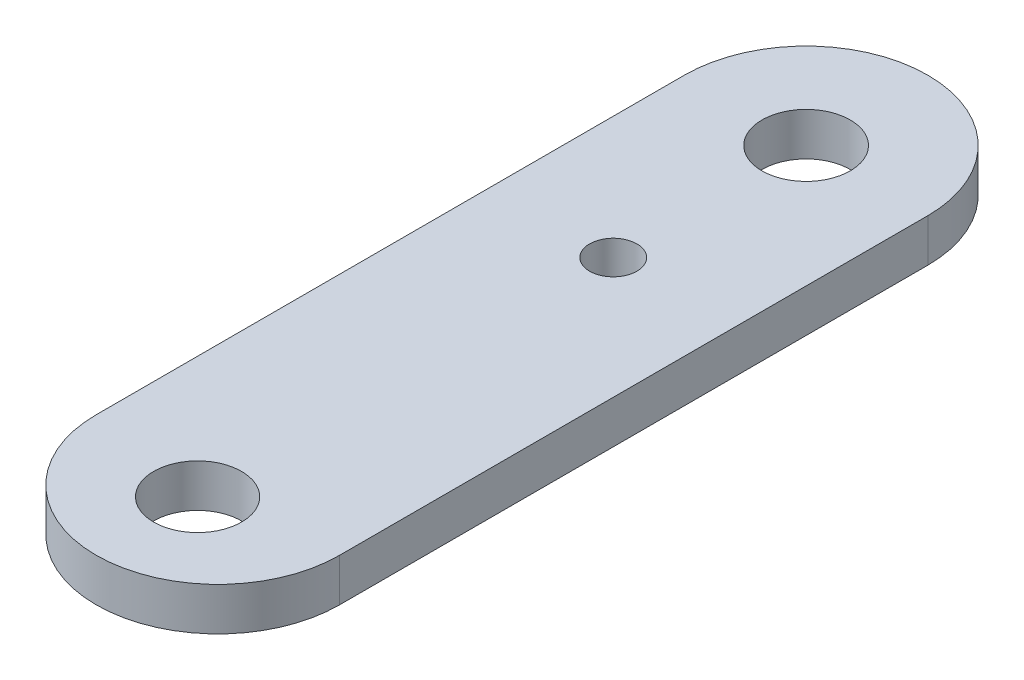
ISO-10303-21;
HEADER;
FILE_DESCRIPTION(('STEP AP214'),'2;1');
FILE_NAME('part.step','',(''),(''),'','','');
FILE_SCHEMA(('AUTOMOTIVE_DESIGN { 1 0 10303 214 1 1 1 1 }'));
ENDSEC;
DATA;
#1=APPLICATION_CONTEXT('core data for automotive mechanical design processes');
#2=APPLICATION_PROTOCOL_DEFINITION('international standard','automotive_design',2000,#1);
#3=PRODUCT_CONTEXT('',#1,'mechanical');
#4=PRODUCT('Part','Part','',(#3));
#5=PRODUCT_RELATED_PRODUCT_CATEGORY('part','',(#4));
#6=PRODUCT_DEFINITION_FORMATION('','',#4);
#7=PRODUCT_DEFINITION_CONTEXT('part definition',#1,'design');
#8=PRODUCT_DEFINITION('design','',#6,#7);
#9=PRODUCT_DEFINITION_SHAPE('','',#8);
#10=(LENGTH_UNIT() NAMED_UNIT(*) SI_UNIT(.MILLI.,.METRE.));
#11=(NAMED_UNIT(*) PLANE_ANGLE_UNIT() SI_UNIT($,.RADIAN.));
#12=(NAMED_UNIT(*) SI_UNIT($,.STERADIAN.) SOLID_ANGLE_UNIT());
#13=UNCERTAINTY_MEASURE_WITH_UNIT(LENGTH_MEASURE(1.E-05),#10,'distance_accuracy_value','');
#14=(GEOMETRIC_REPRESENTATION_CONTEXT(3) GLOBAL_UNCERTAINTY_ASSIGNED_CONTEXT((#13)) GLOBAL_UNIT_ASSIGNED_CONTEXT((#10,
#11,#12)) REPRESENTATION_CONTEXT('',''));
#15=CARTESIAN_POINT('',(0.,0.,0.));
#16=DIRECTION('',(0.,0.,1.));
#17=DIRECTION('',(1.,0.,0.));
#18=AXIS2_PLACEMENT_3D('',#15,#16,#17);
#19=CARTESIAN_POINT('',(0.,-3.175,-1.5));
#20=DIRECTION('',(0.,1.,0.));
#21=DIRECTION('',(0.,0.,1.));
#22=AXIS2_PLACEMENT_3D('',#19,#20,#21);
#23=CYLINDRICAL_SURFACE('',#22,9.);
#24=CARTESIAN_POINT('',(0.,0.,-1.5));
#25=DIRECTION('',(0.,1.,0.));
#26=DIRECTION('',(0.,0.,1.));
#27=AXIS2_PLACEMENT_3D('',#24,#25,#26);
#28=CIRCLE('',#27,9.);
#29=CARTESIAN_POINT('',(-9.,0.,-1.5));
#30=VERTEX_POINT('',#29);
#31=CARTESIAN_POINT('',(9.,0.,-1.5));
#32=VERTEX_POINT('',#31);
#33=EDGE_CURVE('E107',#30,#32,#28,.T.);
#34=ORIENTED_EDGE('',*,*,#33,.F.);
#35=DIRECTION('',(0.,1.,0.));
#36=VECTOR('',#35,1.);
#37=CARTESIAN_POINT('',(-9.,-3.175,-1.5));
#38=LINE('',#37,#36);
#39=CARTESIAN_POINT('',(-9.,-3.175,-1.5));
#40=VERTEX_POINT('',#39);
#41=EDGE_CURVE('E11',#40,#30,#38,.T.);
#42=ORIENTED_EDGE('',*,*,#41,.F.);
#43=CARTESIAN_POINT('',(0.,-3.175,-1.5));
#44=DIRECTION('',(0.,1.,0.));
#45=DIRECTION('',(0.,0.,1.));
#46=AXIS2_PLACEMENT_3D('',#43,#44,#45);
#47=CIRCLE('',#46,9.);
#48=CARTESIAN_POINT('',(9.,-3.175,-1.5));
#49=VERTEX_POINT('',#48);
#50=EDGE_CURVE('E100',#40,#49,#47,.T.);
#51=ORIENTED_EDGE('',*,*,#50,.T.);
#52=DIRECTION('',(0.,1.,0.));
#53=VECTOR('',#52,1.);
#54=CARTESIAN_POINT('',(9.,-3.175,-1.5));
#55=LINE('',#54,#53);
#56=EDGE_CURVE('E45',#49,#32,#55,.T.);
#57=ORIENTED_EDGE('',*,*,#56,.T.);
#58=EDGE_LOOP('',(#34,#42,#51,#57));
#59=FACE_BOUND('',#58,.T.);
#60=ADVANCED_FACE('F42',(#59),#23,.T.);
#61=CARTESIAN_POINT('',(-9.,-3.175,-1.5));
#62=DIRECTION('',(-1.,0.,0.));
#63=DIRECTION('',(0.,0.,1.));
#64=AXIS2_PLACEMENT_3D('',#61,#62,#63);
#65=PLANE('',#64);
#66=DIRECTION('',(0.,0.,1.));
#67=VECTOR('',#66,1.);
#68=CARTESIAN_POINT('',(-9.,0.,-1.5));
#69=LINE('',#68,#67);
#70=CARTESIAN_POINT('',(-9.,0.,-45.));
#71=VERTEX_POINT('',#70);
#72=EDGE_CURVE('E102',#71,#30,#69,.T.);
#73=ORIENTED_EDGE('',*,*,#72,.F.);
#74=DIRECTION('',(0.,1.,0.));
#75=VECTOR('',#74,1.);
#76=CARTESIAN_POINT('',(-9.,-3.175,-45.));
#77=LINE('',#76,#75);
#78=CARTESIAN_POINT('',(-9.,-3.175,-45.));
#79=VERTEX_POINT('',#78);
#80=EDGE_CURVE('E51',#79,#71,#77,.T.);
#81=ORIENTED_EDGE('',*,*,#80,.F.);
#82=DIRECTION('',(0.,0.,1.));
#83=VECTOR('',#82,1.);
#84=CARTESIAN_POINT('',(-9.,-3.175,-1.5));
#85=LINE('',#84,#83);
#86=EDGE_CURVE('E97',#79,#40,#85,.T.);
#87=ORIENTED_EDGE('',*,*,#86,.T.);
#88=ORIENTED_EDGE('',*,*,#41,.T.);
#89=EDGE_LOOP('',(#73,#81,#87,#88));
#90=FACE_BOUND('',#89,.T.);
#91=ADVANCED_FACE('F118',(#90),#65,.T.);
#92=CARTESIAN_POINT('',(0.,-3.175,-45.));
#93=DIRECTION('',(0.,1.,0.));
#94=DIRECTION('',(0.,0.,1.));
#95=AXIS2_PLACEMENT_3D('',#92,#93,#94);
#96=CYLINDRICAL_SURFACE('',#95,9.);
#97=CARTESIAN_POINT('',(0.,0.,-45.));
#98=DIRECTION('',(0.,1.,0.));
#99=DIRECTION('',(0.,0.,-1.));
#100=AXIS2_PLACEMENT_3D('',#97,#98,#99);
#101=CIRCLE('',#100,9.);
#102=CARTESIAN_POINT('',(9.,0.,-45.));
#103=VERTEX_POINT('',#102);
#104=EDGE_CURVE('E92',#103,#71,#101,.T.);
#105=ORIENTED_EDGE('',*,*,#104,.F.);
#106=DIRECTION('',(0.,1.,0.));
#107=VECTOR('',#106,1.);
#108=CARTESIAN_POINT('',(9.,-3.175,-45.));
#109=LINE('',#108,#107);
#110=CARTESIAN_POINT('',(9.,-3.175,-45.));
#111=VERTEX_POINT('',#110);
#112=EDGE_CURVE('E87',#111,#103,#109,.T.);
#113=ORIENTED_EDGE('',*,*,#112,.F.);
#114=CARTESIAN_POINT('',(0.,-3.175,-45.));
#115=DIRECTION('',(0.,1.,0.));
#116=DIRECTION('',(0.,0.,-1.));
#117=AXIS2_PLACEMENT_3D('',#114,#115,#116);
#118=CIRCLE('',#117,9.);
#119=EDGE_CURVE('E90',#111,#79,#118,.T.);
#120=ORIENTED_EDGE('',*,*,#119,.T.);
#121=ORIENTED_EDGE('',*,*,#80,.T.);
#122=EDGE_LOOP('',(#105,#113,#120,#121));
#123=FACE_BOUND('',#122,.T.);
#124=ADVANCED_FACE('F89',(#123),#96,.T.);
#125=CARTESIAN_POINT('',(9.,-3.175,-1.5));
#126=DIRECTION('',(1.,0.,0.));
#127=DIRECTION('',(0.,0.,-1.));
#128=AXIS2_PLACEMENT_3D('',#125,#126,#127);
#129=PLANE('',#128);
#130=DIRECTION('',(0.,0.,-1.));
#131=VECTOR('',#130,1.);
#132=CARTESIAN_POINT('',(9.,0.,-1.5));
#133=LINE('',#132,#131);
#134=EDGE_CURVE('E110',#32,#103,#133,.T.);
#135=ORIENTED_EDGE('',*,*,#134,.F.);
#136=ORIENTED_EDGE('',*,*,#56,.F.);
#137=DIRECTION('',(0.,0.,-1.));
#138=VECTOR('',#137,1.);
#139=CARTESIAN_POINT('',(9.,-3.175,-1.5));
#140=LINE('',#139,#138);
#141=EDGE_CURVE('E96',#49,#111,#140,.T.);
#142=ORIENTED_EDGE('',*,*,#141,.T.);
#143=ORIENTED_EDGE('',*,*,#112,.T.);
#144=EDGE_LOOP('',(#135,#136,#142,#143));
#145=FACE_BOUND('',#144,.T.);
#146=ADVANCED_FACE('F99',(#145),#129,.T.);
#147=CARTESIAN_POINT('',(0.,-3.175,-1.5));
#148=DIRECTION('',(0.,1.,0.));
#149=DIRECTION('',(0.,0.,1.));
#150=AXIS2_PLACEMENT_3D('',#147,#148,#149);
#151=PLANE('',#150);
#152=CARTESIAN_POINT('',(0.0499999999996999,-3.175,-30.6875039859444));
#153=DIRECTION('',(0.,-1.,0.));
#154=DIRECTION('',(0.,0.,-1.));
#155=AXIS2_PLACEMENT_3D('',#152,#153,#154);
#156=CIRCLE('',#155,1.75);
#157=CARTESIAN_POINT('',(0.0499999999996999,-3.175,-32.4375039859444));
#158=VERTEX_POINT('',#157);
#159=EDGE_CURVE('E158',#158,#158,#156,.T.);
#160=ORIENTED_EDGE('',*,*,#159,.F.);
#161=EDGE_LOOP('',(#160));
#162=FACE_BOUND('',#161,.T.);
#163=CARTESIAN_POINT('',(0.,-3.175,-45.));
#164=DIRECTION('',(0.,1.,0.));
#165=DIRECTION('',(0.,0.,1.));
#166=AXIS2_PLACEMENT_3D('',#163,#164,#165);
#167=CIRCLE('',#166,3.26390000000001);
#168=CARTESIAN_POINT('',(0.,-3.175,-41.7361));
#169=VERTEX_POINT('',#168);
#170=EDGE_CURVE('E162',#169,#169,#167,.T.);
#171=ORIENTED_EDGE('',*,*,#170,.T.);
#172=EDGE_LOOP('',(#171));
#173=FACE_BOUND('',#172,.T.);
#174=CARTESIAN_POINT('',(0.,-3.175,0.));
#175=DIRECTION('',(0.,1.,0.));
#176=DIRECTION('',(0.,0.,1.));
#177=AXIS2_PLACEMENT_3D('',#174,#175,#176);
#178=CIRCLE('',#177,3.25);
#179=CARTESIAN_POINT('',(0.,-3.175,3.25));
#180=VERTEX_POINT('',#179);
#181=EDGE_CURVE('E111',#180,#180,#178,.T.);
#182=ORIENTED_EDGE('',*,*,#181,.T.);
#183=EDGE_LOOP('',(#182));
#184=FACE_BOUND('',#183,.T.);
#185=ORIENTED_EDGE('',*,*,#50,.F.);
#186=ORIENTED_EDGE('',*,*,#86,.F.);
#187=ORIENTED_EDGE('',*,*,#119,.F.);
#188=ORIENTED_EDGE('',*,*,#141,.F.);
#189=EDGE_LOOP('',(#185,#186,#187,#188));
#190=FACE_BOUND('',#189,.T.);
#191=ADVANCED_FACE('F95',(#162,#173,#184,#190),#151,.F.);
#192=CARTESIAN_POINT('',(0.,0.,-1.5));
#193=DIRECTION('',(0.,1.,0.));
#194=DIRECTION('',(0.,0.,1.));
#195=AXIS2_PLACEMENT_3D('',#192,#193,#194);
#196=PLANE('',#195);
#197=CARTESIAN_POINT('',(0.0499999999996999,0.,-30.6875039859444));
#198=DIRECTION('',(0.,1.,0.));
#199=DIRECTION('',(0.,0.,1.));
#200=AXIS2_PLACEMENT_3D('',#197,#198,#199);
#201=CIRCLE('',#200,1.75);
#202=CARTESIAN_POINT('',(0.0499999999996999,0.,-28.9375039859444));
#203=VERTEX_POINT('',#202);
#204=EDGE_CURVE('E156',#203,#203,#201,.F.);
#205=ORIENTED_EDGE('',*,*,#204,.T.);
#206=EDGE_LOOP('',(#205));
#207=FACE_BOUND('',#206,.T.);
#208=CARTESIAN_POINT('',(0.,0.,-45.));
#209=DIRECTION('',(0.,1.,0.));
#210=DIRECTION('',(0.,0.,1.));
#211=AXIS2_PLACEMENT_3D('',#208,#209,#210);
#212=CIRCLE('',#211,3.26390000000001);
#213=CARTESIAN_POINT('',(0.,0.,-41.7361));
#214=VERTEX_POINT('',#213);
#215=EDGE_CURVE('E159',#214,#214,#212,.T.);
#216=ORIENTED_EDGE('',*,*,#215,.F.);
#217=EDGE_LOOP('',(#216));
#218=FACE_BOUND('',#217,.T.);
#219=CARTESIAN_POINT('',(0.,0.,0.));
#220=DIRECTION('',(0.,1.,0.));
#221=DIRECTION('',(0.,0.,1.));
#222=AXIS2_PLACEMENT_3D('',#219,#220,#221);
#223=CIRCLE('',#222,3.25);
#224=CARTESIAN_POINT('',(0.,0.,3.25));
#225=VERTEX_POINT('',#224);
#226=EDGE_CURVE('E167',#225,#225,#223,.T.);
#227=ORIENTED_EDGE('',*,*,#226,.F.);
#228=EDGE_LOOP('',(#227));
#229=FACE_BOUND('',#228,.T.);
#230=ORIENTED_EDGE('',*,*,#33,.T.);
#231=ORIENTED_EDGE('',*,*,#134,.T.);
#232=ORIENTED_EDGE('',*,*,#104,.T.);
#233=ORIENTED_EDGE('',*,*,#72,.T.);
#234=EDGE_LOOP('',(#230,#231,#232,#233));
#235=FACE_BOUND('',#234,.T.);
#236=ADVANCED_FACE('F117',(#207,#218,#229,#235),#196,.T.);
#237=CARTESIAN_POINT('',(0.,-3.175,0.));
#238=DIRECTION('',(0.,1.,0.));
#239=DIRECTION('',(0.,0.,1.));
#240=AXIS2_PLACEMENT_3D('',#237,#238,#239);
#241=CYLINDRICAL_SURFACE('',#240,3.25);
#242=ORIENTED_EDGE('',*,*,#181,.F.);
#243=EDGE_LOOP('',(#242));
#244=FACE_BOUND('',#243,.T.);
#245=ORIENTED_EDGE('',*,*,#226,.T.);
#246=EDGE_LOOP('',(#245));
#247=FACE_BOUND('',#246,.T.);
#248=ADVANCED_FACE('F138',(#244,#247),#241,.F.);
#249=CARTESIAN_POINT('',(0.,-3.175,-45.));
#250=DIRECTION('',(0.,1.,0.));
#251=DIRECTION('',(0.,0.,1.));
#252=AXIS2_PLACEMENT_3D('',#249,#250,#251);
#253=CYLINDRICAL_SURFACE('',#252,3.26390000000001);
#254=ORIENTED_EDGE('',*,*,#170,.F.);
#255=EDGE_LOOP('',(#254));
#256=FACE_BOUND('',#255,.T.);
#257=ORIENTED_EDGE('',*,*,#215,.T.);
#258=EDGE_LOOP('',(#257));
#259=FACE_BOUND('',#258,.T.);
#260=ADVANCED_FACE('F144',(#256,#259),#253,.F.);
#261=CARTESIAN_POINT('',(0.0499999999996999,0.00100000000000013,-30.6875039859444));
#262=DIRECTION('',(0.,-1.,0.));
#263=DIRECTION('',(0.,0.,-1.));
#264=AXIS2_PLACEMENT_3D('',#261,#262,#263);
#265=CYLINDRICAL_SURFACE('',#264,1.75);
#266=ORIENTED_EDGE('',*,*,#204,.F.);
#267=EDGE_LOOP('',(#266));
#268=FACE_BOUND('',#267,.T.);
#269=ORIENTED_EDGE('',*,*,#159,.T.);
#270=EDGE_LOOP('',(#269));
#271=FACE_BOUND('',#270,.T.);
#272=ADVANCED_FACE('F147',(#268,#271),#265,.F.);
#273=CLOSED_SHELL('',(#60,#91,#124,#146,#191,#236,#248,#260,#272));
#274=MANIFOLD_SOLID_BREP('B2',#273);
#275=ADVANCED_BREP_SHAPE_REPRESENTATION('',(#18,#274),#14);
#276=SHAPE_DEFINITION_REPRESENTATION(#9,#275);
ENDSEC;
END-ISO-10303-21;
